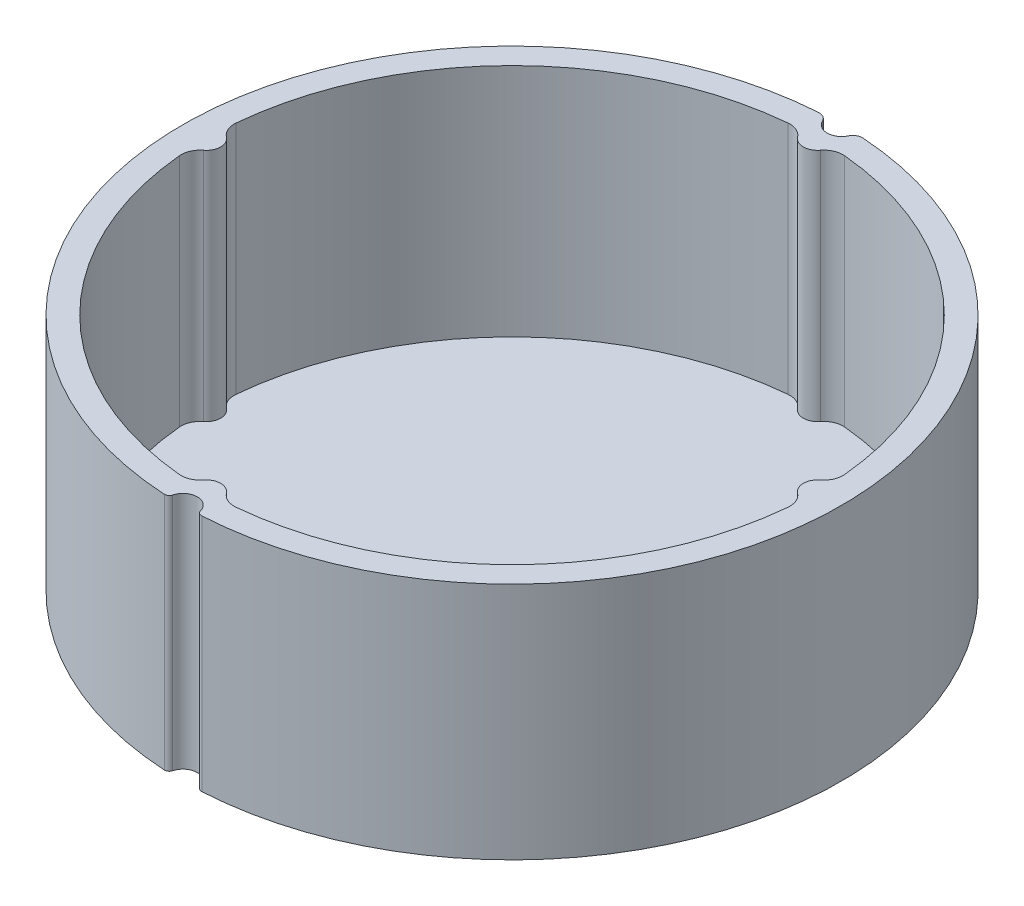
ISO-10303-21;
HEADER;
FILE_DESCRIPTION(('STEP AP214'),'2;1');
FILE_NAME('part.step','',(''),(''),'','','');
FILE_SCHEMA(('AUTOMOTIVE_DESIGN { 1 0 10303 214 1 1 1 1 }'));
ENDSEC;
DATA;
#1=APPLICATION_CONTEXT('core data for automotive mechanical design processes');
#2=APPLICATION_PROTOCOL_DEFINITION('international standard','automotive_design',2000,#1);
#3=PRODUCT_CONTEXT('',#1,'mechanical');
#4=PRODUCT('Part','Part','',(#3));
#5=PRODUCT_RELATED_PRODUCT_CATEGORY('part','',(#4));
#6=PRODUCT_DEFINITION_FORMATION('','',#4);
#7=PRODUCT_DEFINITION_CONTEXT('part definition',#1,'design');
#8=PRODUCT_DEFINITION('design','',#6,#7);
#9=PRODUCT_DEFINITION_SHAPE('','',#8);
#10=(LENGTH_UNIT() NAMED_UNIT(*) SI_UNIT(.MILLI.,.METRE.));
#11=(NAMED_UNIT(*) PLANE_ANGLE_UNIT() SI_UNIT($,.RADIAN.));
#12=(NAMED_UNIT(*) SI_UNIT($,.STERADIAN.) SOLID_ANGLE_UNIT());
#13=UNCERTAINTY_MEASURE_WITH_UNIT(LENGTH_MEASURE(1.E-05),#10,'distance_accuracy_value','');
#14=(GEOMETRIC_REPRESENTATION_CONTEXT(3) GLOBAL_UNCERTAINTY_ASSIGNED_CONTEXT((#13)) GLOBAL_UNIT_ASSIGNED_CONTEXT((#10,
#11,#12)) REPRESENTATION_CONTEXT('',''));
#15=CARTESIAN_POINT('',(0.,0.,0.));
#16=DIRECTION('',(0.,0.,1.));
#17=DIRECTION('',(1.,0.,0.));
#18=AXIS2_PLACEMENT_3D('',#15,#16,#17);
#19=CARTESIAN_POINT('',(0.,25.,0.));
#20=DIRECTION('',(0.,1.,0.));
#21=DIRECTION('',(0.,0.,1.));
#22=AXIS2_PLACEMENT_3D('',#19,#20,#21);
#23=PLANE('',#22);
#24=CARTESIAN_POINT('',(-1.93575856721061,25.,33.9428491683965));
#25=DIRECTION('',(0.,1.,0.));
#26=DIRECTION('',(0.,0.,1.));
#27=AXIS2_PLACEMENT_3D('',#24,#25,#26);
#28=CIRCLE('',#27,0.500000000000003);
#29=CARTESIAN_POINT('',(-1.45181892540796,25.,34.0685568574689));
#30=VERTEX_POINT('',#29);
#31=CARTESIAN_POINT('',(-1.96422560496371,25.,34.4420381383884));
#32=VERTEX_POINT('',#31);
#33=EDGE_CURVE('E338',#30,#32,#28,.F.);
#34=ORIENTED_EDGE('',*,*,#33,.F.);
#35=CARTESIAN_POINT('',(0.,25.,34.4456799246862));
#36=DIRECTION('',(0.,1.,0.));
#37=DIRECTION('',(0.,0.,1.));
#38=AXIS2_PLACEMENT_3D('',#35,#36,#37);
#39=CIRCLE('',#38,1.50000000000002);
#40=CARTESIAN_POINT('',(1.45181892540796,25.,34.0685568574689));
#41=VERTEX_POINT('',#40);
#42=EDGE_CURVE('E342',#41,#30,#39,.T.);
#43=ORIENTED_EDGE('',*,*,#42,.F.);
#44=CARTESIAN_POINT('',(1.93575856721061,25.,33.9428491683965));
#45=DIRECTION('',(0.,1.,0.));
#46=DIRECTION('',(0.,0.,1.));
#47=AXIS2_PLACEMENT_3D('',#44,#45,#46);
#48=CIRCLE('',#47,0.500000000000003);
#49=CARTESIAN_POINT('',(1.9642256049637,25.,34.4420381383884));
#50=VERTEX_POINT('',#49);
#51=EDGE_CURVE('E347',#41,#50,#48,.T.);
#52=ORIENTED_EDGE('',*,*,#51,.T.);
#53=CARTESIAN_POINT('',(0.,25.,-0.0020007910519898));
#54=DIRECTION('',(0.,1.,0.));
#55=DIRECTION('',(0.,0.,1.));
#56=AXIS2_PLACEMENT_3D('',#53,#54,#55);
#57=CIRCLE('',#56,34.5);
#58=CARTESIAN_POINT('',(2.32413582105506,25.,-34.4236276074198));
#59=VERTEX_POINT('',#58);
#60=EDGE_CURVE('E350',#50,#59,#57,.T.);
#61=ORIENTED_EDGE('',*,*,#60,.T.);
#62=CARTESIAN_POINT('',(2.2567695653723,25.,-33.4258992939019));
#63=DIRECTION('',(0.,1.,0.));
#64=DIRECTION('',(0.,0.,1.));
#65=AXIS2_PLACEMENT_3D('',#62,#63,#64);
#66=CIRCLE('',#65,1.);
#67=CARTESIAN_POINT('',(1.35406173922335,25.,-33.8561533823304));
#68=VERTEX_POINT('',#67);
#69=EDGE_CURVE('E353',#68,#59,#66,.F.);
#70=ORIENTED_EDGE('',*,*,#69,.F.);
#71=CARTESIAN_POINT('',(0.,25.,-34.5015345149731));
#72=DIRECTION('',(0.,1.,0.));
#73=DIRECTION('',(0.,0.,1.));
#74=AXIS2_PLACEMENT_3D('',#71,#72,#73);
#75=CIRCLE('',#74,1.49999999999991);
#76=CARTESIAN_POINT('',(-1.35406173922335,25.,-33.8561533823304));
#77=VERTEX_POINT('',#76);
#78=EDGE_CURVE('E357',#77,#68,#75,.T.);
#79=ORIENTED_EDGE('',*,*,#78,.F.);
#80=CARTESIAN_POINT('',(-2.2567695653723,25.,-33.4258992939019));
#81=DIRECTION('',(0.,1.,0.));
#82=DIRECTION('',(0.,0.,1.));
#83=AXIS2_PLACEMENT_3D('',#80,#81,#82);
#84=CIRCLE('',#83,1.);
#85=CARTESIAN_POINT('',(-2.32413582105505,25.,-34.4236276074198));
#86=VERTEX_POINT('',#85);
#87=EDGE_CURVE('E361',#77,#86,#84,.T.);
#88=ORIENTED_EDGE('',*,*,#87,.T.);
#89=CARTESIAN_POINT('',(0.,25.,-0.0020007910519898));
#90=DIRECTION('',(0.,1.,0.));
#91=DIRECTION('',(0.,0.,1.));
#92=AXIS2_PLACEMENT_3D('',#89,#90,#91);
#93=CIRCLE('',#92,34.5);
#94=EDGE_CURVE('E364',#86,#32,#93,.T.);
#95=ORIENTED_EDGE('',*,*,#94,.T.);
#96=EDGE_LOOP('',(#34,#43,#52,#61,#70,#79,#88,#95));
#97=FACE_BOUND('',#96,.T.);
#98=CARTESIAN_POINT('',(0.,25.,0.));
#99=DIRECTION('',(0.,1.,0.));
#100=DIRECTION('',(0.,0.,1.));
#101=AXIS2_PLACEMENT_3D('',#98,#99,#100);
#102=CIRCLE('',#101,32.);
#103=CARTESIAN_POINT('',(-31.8625,25.,2.9632910336314));
#104=VERTEX_POINT('',#103);
#105=CARTESIAN_POINT('',(-2.96329103363136,25.,31.8625));
#106=VERTEX_POINT('',#105);
#107=EDGE_CURVE('E233',#104,#106,#102,.T.);
#108=ORIENTED_EDGE('',*,*,#107,.F.);
#109=CARTESIAN_POINT('',(-29.87109375,25.,2.77808534402944));
#110=DIRECTION('',(0.,1.,0.));
#111=DIRECTION('',(0.,0.,1.));
#112=AXIS2_PLACEMENT_3D('',#109,#110,#111);
#113=CIRCLE('',#112,2.);
#114=CARTESIAN_POINT('',(-31.0876116071428,25.,1.19060800458406));
#115=VERTEX_POINT('',#114);
#116=EDGE_CURVE('E229',#115,#104,#113,.T.);
#117=ORIENTED_EDGE('',*,*,#116,.F.);
#118=CARTESIAN_POINT('',(-32.,25.,0.));
#119=DIRECTION('',(0.,-1.,0.));
#120=DIRECTION('',(0.,0.,1.));
#121=AXIS2_PLACEMENT_3D('',#118,#119,#120);
#122=CIRCLE('',#121,1.50000000000004);
#123=CARTESIAN_POINT('',(-31.0876116071428,25.,-1.19060800458406));
#124=VERTEX_POINT('',#123);
#125=EDGE_CURVE('E211',#124,#115,#122,.T.);
#126=ORIENTED_EDGE('',*,*,#125,.F.);
#127=CARTESIAN_POINT('',(-29.87109375,25.,-2.77808534402944));
#128=DIRECTION('',(0.,1.,0.));
#129=DIRECTION('',(0.,0.,-1.));
#130=AXIS2_PLACEMENT_3D('',#127,#128,#129);
#131=CIRCLE('',#130,2.);
#132=CARTESIAN_POINT('',(-31.8625,25.,-2.9632910336314));
#133=VERTEX_POINT('',#132);
#134=EDGE_CURVE('E277',#133,#124,#131,.T.);
#135=ORIENTED_EDGE('',*,*,#134,.F.);
#136=CARTESIAN_POINT('',(0.,25.,0.));
#137=DIRECTION('',(0.,1.,0.));
#138=DIRECTION('',(0.,0.,1.));
#139=AXIS2_PLACEMENT_3D('',#136,#137,#138);
#140=CIRCLE('',#139,32.);
#141=CARTESIAN_POINT('',(-2.96329103363135,25.,-31.8625));
#142=VERTEX_POINT('',#141);
#143=EDGE_CURVE('E274',#142,#133,#140,.T.);
#144=ORIENTED_EDGE('',*,*,#143,.F.);
#145=CARTESIAN_POINT('',(-2.7780853440294,25.,-29.87109375));
#146=DIRECTION('',(0.,1.,0.));
#147=DIRECTION('',(0.,0.,1.));
#148=AXIS2_PLACEMENT_3D('',#145,#146,#147);
#149=CIRCLE('',#148,2.);
#150=CARTESIAN_POINT('',(-1.19060800458403,25.,-31.0876116071429));
#151=VERTEX_POINT('',#150);
#152=EDGE_CURVE('E271',#151,#142,#149,.T.);
#153=ORIENTED_EDGE('',*,*,#152,.F.);
#154=CARTESIAN_POINT('',(0.,25.,-32.));
#155=DIRECTION('',(0.,-1.,0.));
#156=DIRECTION('',(0.,0.,1.));
#157=AXIS2_PLACEMENT_3D('',#154,#155,#156);
#158=CIRCLE('',#157,1.5);
#159=CARTESIAN_POINT('',(1.19060800458403,25.,-31.0876116071429));
#160=VERTEX_POINT('',#159);
#161=EDGE_CURVE('E268',#160,#151,#158,.T.);
#162=ORIENTED_EDGE('',*,*,#161,.F.);
#163=CARTESIAN_POINT('',(2.7780853440294,25.,-29.87109375));
#164=DIRECTION('',(0.,1.,0.));
#165=DIRECTION('',(0.,0.,-1.));
#166=AXIS2_PLACEMENT_3D('',#163,#164,#165);
#167=CIRCLE('',#166,2.);
#168=CARTESIAN_POINT('',(2.96329103363136,25.,-31.8625));
#169=VERTEX_POINT('',#168);
#170=EDGE_CURVE('E265',#169,#160,#167,.T.);
#171=ORIENTED_EDGE('',*,*,#170,.F.);
#172=CARTESIAN_POINT('',(0.,25.,0.));
#173=DIRECTION('',(0.,1.,0.));
#174=DIRECTION('',(0.,0.,1.));
#175=AXIS2_PLACEMENT_3D('',#172,#173,#174);
#176=CIRCLE('',#175,32.);
#177=CARTESIAN_POINT('',(31.8625,25.,-2.96329103363136));
#178=VERTEX_POINT('',#177);
#179=EDGE_CURVE('E262',#178,#169,#176,.T.);
#180=ORIENTED_EDGE('',*,*,#179,.F.);
#181=CARTESIAN_POINT('',(29.87109375,25.,-2.7780853440294));
#182=DIRECTION('',(0.,1.,0.));
#183=DIRECTION('',(0.,0.,1.));
#184=AXIS2_PLACEMENT_3D('',#181,#182,#183);
#185=CIRCLE('',#184,2.);
#186=CARTESIAN_POINT('',(31.0876116071429,25.,-1.19060800458403));
#187=VERTEX_POINT('',#186);
#188=EDGE_CURVE('E259',#187,#178,#185,.T.);
#189=ORIENTED_EDGE('',*,*,#188,.F.);
#190=CARTESIAN_POINT('',(32.,25.,0.));
#191=DIRECTION('',(0.,-1.,0.));
#192=DIRECTION('',(0.,0.,1.));
#193=AXIS2_PLACEMENT_3D('',#190,#191,#192);
#194=CIRCLE('',#193,1.5);
#195=CARTESIAN_POINT('',(31.0876116071429,25.,1.19060800458403));
#196=VERTEX_POINT('',#195);
#197=EDGE_CURVE('E256',#196,#187,#194,.T.);
#198=ORIENTED_EDGE('',*,*,#197,.F.);
#199=CARTESIAN_POINT('',(29.87109375,25.,2.7780853440294));
#200=DIRECTION('',(0.,1.,0.));
#201=DIRECTION('',(0.,0.,-1.));
#202=AXIS2_PLACEMENT_3D('',#199,#200,#201);
#203=CIRCLE('',#202,2.);
#204=CARTESIAN_POINT('',(31.8625,25.,2.96329103363136));
#205=VERTEX_POINT('',#204);
#206=EDGE_CURVE('E253',#205,#196,#203,.T.);
#207=ORIENTED_EDGE('',*,*,#206,.F.);
#208=CARTESIAN_POINT('',(0.,25.,0.));
#209=DIRECTION('',(0.,1.,0.));
#210=DIRECTION('',(0.,0.,1.));
#211=AXIS2_PLACEMENT_3D('',#208,#209,#210);
#212=CIRCLE('',#211,32.);
#213=CARTESIAN_POINT('',(2.96329103363136,25.,31.8625));
#214=VERTEX_POINT('',#213);
#215=EDGE_CURVE('E250',#214,#205,#212,.T.);
#216=ORIENTED_EDGE('',*,*,#215,.F.);
#217=CARTESIAN_POINT('',(2.7780853440294,25.,29.87109375));
#218=DIRECTION('',(0.,1.,0.));
#219=DIRECTION('',(0.,0.,1.));
#220=AXIS2_PLACEMENT_3D('',#217,#218,#219);
#221=CIRCLE('',#220,2.);
#222=CARTESIAN_POINT('',(1.19060800458403,25.,31.0876116071429));
#223=VERTEX_POINT('',#222);
#224=EDGE_CURVE('E247',#223,#214,#221,.T.);
#225=ORIENTED_EDGE('',*,*,#224,.F.);
#226=CARTESIAN_POINT('',(0.,25.,32.));
#227=DIRECTION('',(0.,-1.,0.));
#228=DIRECTION('',(0.,0.,1.));
#229=AXIS2_PLACEMENT_3D('',#226,#227,#228);
#230=CIRCLE('',#229,1.5);
#231=CARTESIAN_POINT('',(-1.19060800458403,25.,31.0876116071429));
#232=VERTEX_POINT('',#231);
#233=EDGE_CURVE('E244',#232,#223,#230,.T.);
#234=ORIENTED_EDGE('',*,*,#233,.F.);
#235=CARTESIAN_POINT('',(-2.7780853440294,25.,29.87109375));
#236=DIRECTION('',(0.,1.,0.));
#237=DIRECTION('',(0.,0.,-1.));
#238=AXIS2_PLACEMENT_3D('',#235,#236,#237);
#239=CIRCLE('',#238,2.);
#240=EDGE_CURVE('E241',#106,#232,#239,.T.);
#241=ORIENTED_EDGE('',*,*,#240,.F.);
#242=EDGE_LOOP('',(#108,#117,#126,#135,#144,#153,#162,#171,#180,#189,#198,#207,#216,#225,#234,#241));
#243=FACE_BOUND('',#242,.T.);
#244=ADVANCED_FACE('F41',(#97,#243),#23,.T.);
#245=CARTESIAN_POINT('',(0.,0.,0.));
#246=DIRECTION('',(0.,1.,0.));
#247=DIRECTION('',(0.,0.,1.));
#248=AXIS2_PLACEMENT_3D('',#245,#246,#247);
#249=PLANE('',#248);
#250=CARTESIAN_POINT('',(-1.93575856721061,0.,33.9428491683965));
#251=DIRECTION('',(0.,1.,0.));
#252=DIRECTION('',(0.,0.,1.));
#253=AXIS2_PLACEMENT_3D('',#250,#251,#252);
#254=CIRCLE('',#253,0.500000000000003);
#255=CARTESIAN_POINT('',(-1.45181892540796,0.,34.0685568574689));
#256=VERTEX_POINT('',#255);
#257=CARTESIAN_POINT('',(-1.96422560496371,0.,34.4420381383884));
#258=VERTEX_POINT('',#257);
#259=EDGE_CURVE('E337',#256,#258,#254,.F.);
#260=ORIENTED_EDGE('',*,*,#259,.T.);
#261=CARTESIAN_POINT('',(0.,0.,-0.0020007910519898));
#262=DIRECTION('',(0.,1.,0.));
#263=DIRECTION('',(0.,0.,1.));
#264=AXIS2_PLACEMENT_3D('',#261,#262,#263);
#265=CIRCLE('',#264,34.5);
#266=CARTESIAN_POINT('',(-2.32413582105505,0.,-34.4236276074198));
#267=VERTEX_POINT('',#266);
#268=EDGE_CURVE('E343',#267,#258,#265,.T.);
#269=ORIENTED_EDGE('',*,*,#268,.F.);
#270=CARTESIAN_POINT('',(-2.2567695653723,0.,-33.4258992939019));
#271=DIRECTION('',(0.,1.,0.));
#272=DIRECTION('',(0.,0.,1.));
#273=AXIS2_PLACEMENT_3D('',#270,#271,#272);
#274=CIRCLE('',#273,1.);
#275=CARTESIAN_POINT('',(-1.35406173922335,0.,-33.8561533823304));
#276=VERTEX_POINT('',#275);
#277=EDGE_CURVE('E390',#276,#267,#274,.T.);
#278=ORIENTED_EDGE('',*,*,#277,.F.);
#279=CARTESIAN_POINT('',(0.,0.,-34.5015345149731));
#280=DIRECTION('',(0.,1.,0.));
#281=DIRECTION('',(0.,0.,1.));
#282=AXIS2_PLACEMENT_3D('',#279,#280,#281);
#283=CIRCLE('',#282,1.49999999999991);
#284=CARTESIAN_POINT('',(1.35406173922335,0.,-33.8561533823304));
#285=VERTEX_POINT('',#284);
#286=EDGE_CURVE('E386',#276,#285,#283,.T.);
#287=ORIENTED_EDGE('',*,*,#286,.T.);
#288=CARTESIAN_POINT('',(2.2567695653723,0.,-33.4258992939019));
#289=DIRECTION('',(0.,1.,0.));
#290=DIRECTION('',(0.,0.,1.));
#291=AXIS2_PLACEMENT_3D('',#288,#289,#290);
#292=CIRCLE('',#291,1.);
#293=CARTESIAN_POINT('',(2.32413582105506,0.,-34.4236276074198));
#294=VERTEX_POINT('',#293);
#295=EDGE_CURVE('E382',#285,#294,#292,.F.);
#296=ORIENTED_EDGE('',*,*,#295,.T.);
#297=CARTESIAN_POINT('',(0.,0.,-0.0020007910519898));
#298=DIRECTION('',(0.,1.,0.));
#299=DIRECTION('',(0.,0.,1.));
#300=AXIS2_PLACEMENT_3D('',#297,#298,#299);
#301=CIRCLE('',#300,34.5);
#302=CARTESIAN_POINT('',(1.9642256049637,0.,34.4420381383884));
#303=VERTEX_POINT('',#302);
#304=EDGE_CURVE('E378',#303,#294,#301,.T.);
#305=ORIENTED_EDGE('',*,*,#304,.F.);
#306=CARTESIAN_POINT('',(1.93575856721061,0.,33.9428491683965));
#307=DIRECTION('',(0.,1.,0.));
#308=DIRECTION('',(0.,0.,1.));
#309=AXIS2_PLACEMENT_3D('',#306,#307,#308);
#310=CIRCLE('',#309,0.500000000000003);
#311=CARTESIAN_POINT('',(1.45181892540796,0.,34.0685568574689));
#312=VERTEX_POINT('',#311);
#313=EDGE_CURVE('E375',#312,#303,#310,.T.);
#314=ORIENTED_EDGE('',*,*,#313,.F.);
#315=CARTESIAN_POINT('',(0.,0.,34.4456799246862));
#316=DIRECTION('',(0.,1.,0.));
#317=DIRECTION('',(0.,0.,1.));
#318=AXIS2_PLACEMENT_3D('',#315,#316,#317);
#319=CIRCLE('',#318,1.50000000000002);
#320=EDGE_CURVE('E371',#312,#256,#319,.T.);
#321=ORIENTED_EDGE('',*,*,#320,.T.);
#322=EDGE_LOOP('',(#260,#269,#278,#287,#296,#305,#314,#321));
#323=FACE_BOUND('',#322,.T.);
#324=ADVANCED_FACE('F425',(#323),#249,.F.);
#325=CARTESIAN_POINT('',(-1.93575856721061,25.,33.9428491683965));
#326=DIRECTION('',(0.,-1.,0.));
#327=DIRECTION('',(0.,0.,-1.));
#328=AXIS2_PLACEMENT_3D('',#325,#326,#327);
#329=CYLINDRICAL_SURFACE('',#328,0.500000000000003);
#330=ORIENTED_EDGE('',*,*,#259,.F.);
#331=DIRECTION('',(0.,-1.,0.));
#332=VECTOR('',#331,1.);
#333=CARTESIAN_POINT('',(-1.45181892540796,25.,34.0685568574689));
#334=LINE('',#333,#332);
#335=EDGE_CURVE('E11',#30,#256,#334,.T.);
#336=ORIENTED_EDGE('',*,*,#335,.F.);
#337=ORIENTED_EDGE('',*,*,#33,.T.);
#338=DIRECTION('',(0.,-1.,0.));
#339=VECTOR('',#338,1.);
#340=CARTESIAN_POINT('',(-1.96422560496371,25.,34.4420381383884));
#341=LINE('',#340,#339);
#342=EDGE_CURVE('E367',#32,#258,#341,.T.);
#343=ORIENTED_EDGE('',*,*,#342,.T.);
#344=EDGE_LOOP('',(#330,#336,#337,#343));
#345=FACE_BOUND('',#344,.T.);
#346=ADVANCED_FACE('F43',(#345),#329,.T.);
#347=CARTESIAN_POINT('',(0.,25.,34.4456799246862));
#348=DIRECTION('',(0.,-1.,0.));
#349=DIRECTION('',(0.,0.,-1.));
#350=AXIS2_PLACEMENT_3D('',#347,#348,#349);
#351=CYLINDRICAL_SURFACE('',#350,1.50000000000002);
#352=ORIENTED_EDGE('',*,*,#320,.F.);
#353=DIRECTION('',(0.,-1.,0.));
#354=VECTOR('',#353,1.);
#355=CARTESIAN_POINT('',(1.45181892540796,25.,34.0685568574689));
#356=LINE('',#355,#354);
#357=EDGE_CURVE('E50',#41,#312,#356,.T.);
#358=ORIENTED_EDGE('',*,*,#357,.F.);
#359=ORIENTED_EDGE('',*,*,#42,.T.);
#360=ORIENTED_EDGE('',*,*,#335,.T.);
#361=EDGE_LOOP('',(#352,#358,#359,#360));
#362=FACE_BOUND('',#361,.T.);
#363=ADVANCED_FACE('F426',(#362),#351,.F.);
#364=CARTESIAN_POINT('',(1.93575856721061,25.,33.9428491683965));
#365=DIRECTION('',(0.,-1.,0.));
#366=DIRECTION('',(0.,0.,-1.));
#367=AXIS2_PLACEMENT_3D('',#364,#365,#366);
#368=CYLINDRICAL_SURFACE('',#367,0.500000000000003);
#369=ORIENTED_EDGE('',*,*,#313,.T.);
#370=DIRECTION('',(0.,-1.,0.));
#371=VECTOR('',#370,1.);
#372=CARTESIAN_POINT('',(1.9642256049637,25.,34.4420381383884));
#373=LINE('',#372,#371);
#374=EDGE_CURVE('E411',#50,#303,#373,.T.);
#375=ORIENTED_EDGE('',*,*,#374,.F.);
#376=ORIENTED_EDGE('',*,*,#51,.F.);
#377=ORIENTED_EDGE('',*,*,#357,.T.);
#378=EDGE_LOOP('',(#369,#375,#376,#377));
#379=FACE_BOUND('',#378,.T.);
#380=ADVANCED_FACE('F418',(#379),#368,.T.);
#381=CARTESIAN_POINT('',(0.,25.,-0.0020007910519898));
#382=DIRECTION('',(0.,-1.,0.));
#383=DIRECTION('',(0.,0.,-1.));
#384=AXIS2_PLACEMENT_3D('',#381,#382,#383);
#385=CYLINDRICAL_SURFACE('',#384,34.5);
#386=ORIENTED_EDGE('',*,*,#304,.T.);
#387=DIRECTION('',(0.,-1.,0.));
#388=VECTOR('',#387,1.);
#389=CARTESIAN_POINT('',(2.32413582105506,25.,-34.4236276074198));
#390=LINE('',#389,#388);
#391=EDGE_CURVE('E408',#59,#294,#390,.T.);
#392=ORIENTED_EDGE('',*,*,#391,.F.);
#393=ORIENTED_EDGE('',*,*,#60,.F.);
#394=ORIENTED_EDGE('',*,*,#374,.T.);
#395=EDGE_LOOP('',(#386,#392,#393,#394));
#396=FACE_BOUND('',#395,.T.);
#397=ADVANCED_FACE('F451',(#396),#385,.T.);
#398=CARTESIAN_POINT('',(2.2567695653723,25.,-33.4258992939019));
#399=DIRECTION('',(0.,-1.,0.));
#400=DIRECTION('',(0.,0.,-1.));
#401=AXIS2_PLACEMENT_3D('',#398,#399,#400);
#402=CYLINDRICAL_SURFACE('',#401,1.);
#403=ORIENTED_EDGE('',*,*,#295,.F.);
#404=DIRECTION('',(0.,-1.,0.));
#405=VECTOR('',#404,1.);
#406=CARTESIAN_POINT('',(1.35406173922335,25.,-33.8561533823304));
#407=LINE('',#406,#405);
#408=EDGE_CURVE('E405',#68,#285,#407,.T.);
#409=ORIENTED_EDGE('',*,*,#408,.F.);
#410=ORIENTED_EDGE('',*,*,#69,.T.);
#411=ORIENTED_EDGE('',*,*,#391,.T.);
#412=EDGE_LOOP('',(#403,#409,#410,#411));
#413=FACE_BOUND('',#412,.T.);
#414=ADVANCED_FACE('F446',(#413),#402,.T.);
#415=CARTESIAN_POINT('',(0.,25.,-34.5015345149731));
#416=DIRECTION('',(0.,-1.,0.));
#417=DIRECTION('',(0.,0.,-1.));
#418=AXIS2_PLACEMENT_3D('',#415,#416,#417);
#419=CYLINDRICAL_SURFACE('',#418,1.49999999999991);
#420=ORIENTED_EDGE('',*,*,#286,.F.);
#421=DIRECTION('',(0.,-1.,0.));
#422=VECTOR('',#421,1.);
#423=CARTESIAN_POINT('',(-1.35406173922335,25.,-33.8561533823304));
#424=LINE('',#423,#422);
#425=EDGE_CURVE('E402',#77,#276,#424,.T.);
#426=ORIENTED_EDGE('',*,*,#425,.F.);
#427=ORIENTED_EDGE('',*,*,#78,.T.);
#428=ORIENTED_EDGE('',*,*,#408,.T.);
#429=EDGE_LOOP('',(#420,#426,#427,#428));
#430=FACE_BOUND('',#429,.T.);
#431=ADVANCED_FACE('F443',(#430),#419,.F.);
#432=CARTESIAN_POINT('',(-2.2567695653723,25.,-33.4258992939019));
#433=DIRECTION('',(0.,-1.,0.));
#434=DIRECTION('',(0.,0.,-1.));
#435=AXIS2_PLACEMENT_3D('',#432,#433,#434);
#436=CYLINDRICAL_SURFACE('',#435,1.);
#437=ORIENTED_EDGE('',*,*,#277,.T.);
#438=DIRECTION('',(0.,-1.,0.));
#439=VECTOR('',#438,1.);
#440=CARTESIAN_POINT('',(-2.32413582105505,25.,-34.4236276074198));
#441=LINE('',#440,#439);
#442=EDGE_CURVE('E398',#86,#267,#441,.T.);
#443=ORIENTED_EDGE('',*,*,#442,.F.);
#444=ORIENTED_EDGE('',*,*,#87,.F.);
#445=ORIENTED_EDGE('',*,*,#425,.T.);
#446=EDGE_LOOP('',(#437,#443,#444,#445));
#447=FACE_BOUND('',#446,.T.);
#448=ADVANCED_FACE('F440',(#447),#436,.T.);
#449=CARTESIAN_POINT('',(0.,25.,-0.0020007910519898));
#450=DIRECTION('',(0.,-1.,0.));
#451=DIRECTION('',(0.,0.,-1.));
#452=AXIS2_PLACEMENT_3D('',#449,#450,#451);
#453=CYLINDRICAL_SURFACE('',#452,34.5);
#454=ORIENTED_EDGE('',*,*,#268,.T.);
#455=ORIENTED_EDGE('',*,*,#342,.F.);
#456=ORIENTED_EDGE('',*,*,#94,.F.);
#457=ORIENTED_EDGE('',*,*,#442,.T.);
#458=EDGE_LOOP('',(#454,#455,#456,#457));
#459=FACE_BOUND('',#458,.T.);
#460=ADVANCED_FACE('F435',(#459),#453,.T.);
#461=CARTESIAN_POINT('',(-29.87109375,25.,2.77808534402944));
#462=DIRECTION('',(0.,-1.,0.));
#463=DIRECTION('',(0.,0.,-1.));
#464=AXIS2_PLACEMENT_3D('',#461,#462,#463);
#465=CYLINDRICAL_SURFACE('',#464,2.);
#466=CARTESIAN_POINT('',(-29.87109375,0.4,2.77808534402944));
#467=DIRECTION('',(0.,1.,0.));
#468=DIRECTION('',(0.,0.,1.));
#469=AXIS2_PLACEMENT_3D('',#466,#467,#468);
#470=CIRCLE('',#469,2.);
#471=CARTESIAN_POINT('',(-31.0876116071428,0.4,1.19060800458406));
#472=VERTEX_POINT('',#471);
#473=CARTESIAN_POINT('',(-31.8625,0.400000000000001,2.9632910336314));
#474=VERTEX_POINT('',#473);
#475=EDGE_CURVE('E218',#472,#474,#470,.T.);
#476=ORIENTED_EDGE('',*,*,#475,.F.);
#477=DIRECTION('',(0.,-1.,0.));
#478=VECTOR('',#477,1.);
#479=CARTESIAN_POINT('',(-31.0876116071428,25.,1.19060800458406));
#480=LINE('',#479,#478);
#481=EDGE_CURVE('E204',#115,#472,#480,.T.);
#482=ORIENTED_EDGE('',*,*,#481,.F.);
#483=ORIENTED_EDGE('',*,*,#116,.T.);
#484=DIRECTION('',(0.,-1.,0.));
#485=VECTOR('',#484,1.);
#486=CARTESIAN_POINT('',(-31.8625,25.,2.9632910336314));
#487=LINE('',#486,#485);
#488=EDGE_CURVE('E220',#104,#474,#487,.T.);
#489=ORIENTED_EDGE('',*,*,#488,.T.);
#490=EDGE_LOOP('',(#476,#482,#483,#489));
#491=FACE_BOUND('',#490,.T.);
#492=ADVANCED_FACE('F219',(#491),#465,.F.);
#493=CARTESIAN_POINT('',(0.,25.,0.));
#494=DIRECTION('',(0.,-1.,0.));
#495=DIRECTION('',(0.,0.,-1.));
#496=AXIS2_PLACEMENT_3D('',#493,#494,#495);
#497=CYLINDRICAL_SURFACE('',#496,32.);
#498=CARTESIAN_POINT('',(0.,0.4,0.));
#499=DIRECTION('',(0.,1.,0.));
#500=DIRECTION('',(0.,0.,1.));
#501=AXIS2_PLACEMENT_3D('',#498,#499,#500);
#502=CIRCLE('',#501,32.);
#503=CARTESIAN_POINT('',(-2.96329103363136,0.400000000000001,31.8625));
#504=VERTEX_POINT('',#503);
#505=EDGE_CURVE('E57',#474,#504,#502,.T.);
#506=ORIENTED_EDGE('',*,*,#505,.F.);
#507=ORIENTED_EDGE('',*,*,#488,.F.);
#508=ORIENTED_EDGE('',*,*,#107,.T.);
#509=DIRECTION('',(0.,-1.,0.));
#510=VECTOR('',#509,1.);
#511=CARTESIAN_POINT('',(-2.96329103363136,25.,31.8625));
#512=LINE('',#511,#510);
#513=EDGE_CURVE('E332',#106,#504,#512,.T.);
#514=ORIENTED_EDGE('',*,*,#513,.T.);
#515=EDGE_LOOP('',(#506,#507,#508,#514));
#516=FACE_BOUND('',#515,.T.);
#517=ADVANCED_FACE('F459',(#516),#497,.F.);
#518=CARTESIAN_POINT('',(-2.7780853440294,25.,29.87109375));
#519=DIRECTION('',(0.,-1.,0.));
#520=DIRECTION('',(0.,0.,-1.));
#521=AXIS2_PLACEMENT_3D('',#518,#519,#520);
#522=CYLINDRICAL_SURFACE('',#521,2.);
#523=CARTESIAN_POINT('',(-2.7780853440294,0.4,29.87109375));
#524=DIRECTION('',(0.,1.,0.));
#525=DIRECTION('',(0.,0.,-1.));
#526=AXIS2_PLACEMENT_3D('',#523,#524,#525);
#527=CIRCLE('',#526,2.);
#528=CARTESIAN_POINT('',(-1.19060800458403,0.400000000000001,31.0876116071429));
#529=VERTEX_POINT('',#528);
#530=EDGE_CURVE('E65',#504,#529,#527,.T.);
#531=ORIENTED_EDGE('',*,*,#530,.F.);
#532=ORIENTED_EDGE('',*,*,#513,.F.);
#533=ORIENTED_EDGE('',*,*,#240,.T.);
#534=DIRECTION('',(0.,-1.,0.));
#535=VECTOR('',#534,1.);
#536=CARTESIAN_POINT('',(-1.19060800458403,25.,31.0876116071429));
#537=LINE('',#536,#535);
#538=EDGE_CURVE('E329',#232,#529,#537,.T.);
#539=ORIENTED_EDGE('',*,*,#538,.T.);
#540=EDGE_LOOP('',(#531,#532,#533,#539));
#541=FACE_BOUND('',#540,.T.);
#542=ADVANCED_FACE('F460',(#541),#522,.F.);
#543=CARTESIAN_POINT('',(0.,25.,32.));
#544=DIRECTION('',(0.,-1.,0.));
#545=DIRECTION('',(0.,0.,-1.));
#546=AXIS2_PLACEMENT_3D('',#543,#544,#545);
#547=CYLINDRICAL_SURFACE('',#546,1.5);
#548=CARTESIAN_POINT('',(0.,0.4,32.));
#549=DIRECTION('',(0.,-1.,0.));
#550=DIRECTION('',(0.,0.,1.));
#551=AXIS2_PLACEMENT_3D('',#548,#549,#550);
#552=CIRCLE('',#551,1.5);
#553=CARTESIAN_POINT('',(1.19060800458403,0.400000000000001,31.0876116071429));
#554=VERTEX_POINT('',#553);
#555=EDGE_CURVE('E466',#529,#554,#552,.T.);
#556=ORIENTED_EDGE('',*,*,#555,.F.);
#557=ORIENTED_EDGE('',*,*,#538,.F.);
#558=ORIENTED_EDGE('',*,*,#233,.T.);
#559=DIRECTION('',(0.,-1.,0.));
#560=VECTOR('',#559,1.);
#561=CARTESIAN_POINT('',(1.19060800458403,25.,31.0876116071429));
#562=LINE('',#561,#560);
#563=EDGE_CURVE('E325',#223,#554,#562,.T.);
#564=ORIENTED_EDGE('',*,*,#563,.T.);
#565=EDGE_LOOP('',(#556,#557,#558,#564));
#566=FACE_BOUND('',#565,.T.);
#567=ADVANCED_FACE('F463',(#566),#547,.T.);
#568=CARTESIAN_POINT('',(2.7780853440294,25.,29.87109375));
#569=DIRECTION('',(0.,-1.,0.));
#570=DIRECTION('',(0.,0.,-1.));
#571=AXIS2_PLACEMENT_3D('',#568,#569,#570);
#572=CYLINDRICAL_SURFACE('',#571,2.);
#573=CARTESIAN_POINT('',(2.7780853440294,0.4,29.87109375));
#574=DIRECTION('',(0.,1.,0.));
#575=DIRECTION('',(0.,0.,1.));
#576=AXIS2_PLACEMENT_3D('',#573,#574,#575);
#577=CIRCLE('',#576,2.);
#578=CARTESIAN_POINT('',(2.96329103363136,0.400000000000001,31.8625));
#579=VERTEX_POINT('',#578);
#580=EDGE_CURVE('E482',#554,#579,#577,.T.);
#581=ORIENTED_EDGE('',*,*,#580,.F.);
#582=ORIENTED_EDGE('',*,*,#563,.F.);
#583=ORIENTED_EDGE('',*,*,#224,.T.);
#584=DIRECTION('',(0.,-1.,0.));
#585=VECTOR('',#584,1.);
#586=CARTESIAN_POINT('',(2.96329103363136,25.,31.8625));
#587=LINE('',#586,#585);
#588=EDGE_CURVE('E321',#214,#579,#587,.T.);
#589=ORIENTED_EDGE('',*,*,#588,.T.);
#590=EDGE_LOOP('',(#581,#582,#583,#589));
#591=FACE_BOUND('',#590,.T.);
#592=ADVANCED_FACE('F472',(#591),#572,.F.);
#593=CARTESIAN_POINT('',(0.,25.,0.));
#594=DIRECTION('',(0.,-1.,0.));
#595=DIRECTION('',(0.,0.,-1.));
#596=AXIS2_PLACEMENT_3D('',#593,#594,#595);
#597=CYLINDRICAL_SURFACE('',#596,32.);
#598=CARTESIAN_POINT('',(0.,0.4,0.));
#599=DIRECTION('',(0.,1.,0.));
#600=DIRECTION('',(0.,0.,1.));
#601=AXIS2_PLACEMENT_3D('',#598,#599,#600);
#602=CIRCLE('',#601,32.);
#603=CARTESIAN_POINT('',(31.8625,0.400000000000001,2.96329103363136));
#604=VERTEX_POINT('',#603);
#605=EDGE_CURVE('E478',#579,#604,#602,.T.);
#606=ORIENTED_EDGE('',*,*,#605,.F.);
#607=ORIENTED_EDGE('',*,*,#588,.F.);
#608=ORIENTED_EDGE('',*,*,#215,.T.);
#609=DIRECTION('',(0.,-1.,0.));
#610=VECTOR('',#609,1.);
#611=CARTESIAN_POINT('',(31.8625,25.,2.96329103363136));
#612=LINE('',#611,#610);
#613=EDGE_CURVE('E317',#205,#604,#612,.T.);
#614=ORIENTED_EDGE('',*,*,#613,.T.);
#615=EDGE_LOOP('',(#606,#607,#608,#614));
#616=FACE_BOUND('',#615,.T.);
#617=ADVANCED_FACE('F475',(#616),#597,.F.);
#618=CARTESIAN_POINT('',(29.87109375,25.,2.7780853440294));
#619=DIRECTION('',(0.,-1.,0.));
#620=DIRECTION('',(0.,0.,-1.));
#621=AXIS2_PLACEMENT_3D('',#618,#619,#620);
#622=CYLINDRICAL_SURFACE('',#621,2.);
#623=CARTESIAN_POINT('',(29.87109375,0.4,2.7780853440294));
#624=DIRECTION('',(0.,1.,0.));
#625=DIRECTION('',(0.,0.,-1.));
#626=AXIS2_PLACEMENT_3D('',#623,#624,#625);
#627=CIRCLE('',#626,2.);
#628=CARTESIAN_POINT('',(31.0876116071429,0.400000000000001,1.19060800458403));
#629=VERTEX_POINT('',#628);
#630=EDGE_CURVE('E481',#604,#629,#627,.T.);
#631=ORIENTED_EDGE('',*,*,#630,.F.);
#632=ORIENTED_EDGE('',*,*,#613,.F.);
#633=ORIENTED_EDGE('',*,*,#206,.T.);
#634=DIRECTION('',(0.,-1.,0.));
#635=VECTOR('',#634,1.);
#636=CARTESIAN_POINT('',(31.0876116071429,25.,1.19060800458403));
#637=LINE('',#636,#635);
#638=EDGE_CURVE('E313',#196,#629,#637,.T.);
#639=ORIENTED_EDGE('',*,*,#638,.T.);
#640=EDGE_LOOP('',(#631,#632,#633,#639));
#641=FACE_BOUND('',#640,.T.);
#642=ADVANCED_FACE('F559',(#641),#622,.F.);
#643=CARTESIAN_POINT('',(32.,25.,0.));
#644=DIRECTION('',(0.,-1.,0.));
#645=DIRECTION('',(0.,0.,-1.));
#646=AXIS2_PLACEMENT_3D('',#643,#644,#645);
#647=CYLINDRICAL_SURFACE('',#646,1.5);
#648=CARTESIAN_POINT('',(32.,0.4,0.));
#649=DIRECTION('',(0.,-1.,0.));
#650=DIRECTION('',(0.,0.,1.));
#651=AXIS2_PLACEMENT_3D('',#648,#649,#650);
#652=CIRCLE('',#651,1.5);
#653=CARTESIAN_POINT('',(31.0876116071429,0.400000000000001,-1.19060800458403));
#654=VERTEX_POINT('',#653);
#655=EDGE_CURVE('E486',#629,#654,#652,.T.);
#656=ORIENTED_EDGE('',*,*,#655,.F.);
#657=ORIENTED_EDGE('',*,*,#638,.F.);
#658=ORIENTED_EDGE('',*,*,#197,.T.);
#659=DIRECTION('',(0.,-1.,0.));
#660=VECTOR('',#659,1.);
#661=CARTESIAN_POINT('',(31.0876116071429,25.,-1.19060800458403));
#662=LINE('',#661,#660);
#663=EDGE_CURVE('E309',#187,#654,#662,.T.);
#664=ORIENTED_EDGE('',*,*,#663,.T.);
#665=EDGE_LOOP('',(#656,#657,#658,#664));
#666=FACE_BOUND('',#665,.T.);
#667=ADVANCED_FACE('F555',(#666),#647,.T.);
#668=CARTESIAN_POINT('',(29.87109375,25.,-2.7780853440294));
#669=DIRECTION('',(0.,-1.,0.));
#670=DIRECTION('',(0.,0.,-1.));
#671=AXIS2_PLACEMENT_3D('',#668,#669,#670);
#672=CYLINDRICAL_SURFACE('',#671,2.);
#673=CARTESIAN_POINT('',(29.87109375,0.4,-2.7780853440294));
#674=DIRECTION('',(0.,1.,0.));
#675=DIRECTION('',(0.,0.,1.));
#676=AXIS2_PLACEMENT_3D('',#673,#674,#675);
#677=CIRCLE('',#676,2.);
#678=CARTESIAN_POINT('',(31.8625,0.400000000000001,-2.96329103363136));
#679=VERTEX_POINT('',#678);
#680=EDGE_CURVE('E494',#654,#679,#677,.T.);
#681=ORIENTED_EDGE('',*,*,#680,.F.);
#682=ORIENTED_EDGE('',*,*,#663,.F.);
#683=ORIENTED_EDGE('',*,*,#188,.T.);
#684=DIRECTION('',(0.,-1.,0.));
#685=VECTOR('',#684,1.);
#686=CARTESIAN_POINT('',(31.8625,25.,-2.96329103363136));
#687=LINE('',#686,#685);
#688=EDGE_CURVE('E305',#178,#679,#687,.T.);
#689=ORIENTED_EDGE('',*,*,#688,.T.);
#690=EDGE_LOOP('',(#681,#682,#683,#689));
#691=FACE_BOUND('',#690,.T.);
#692=ADVANCED_FACE('F551',(#691),#672,.F.);
#693=CARTESIAN_POINT('',(0.,25.,0.));
#694=DIRECTION('',(0.,-1.,0.));
#695=DIRECTION('',(0.,0.,-1.));
#696=AXIS2_PLACEMENT_3D('',#693,#694,#695);
#697=CYLINDRICAL_SURFACE('',#696,32.);
#698=CARTESIAN_POINT('',(0.,0.4,0.));
#699=DIRECTION('',(0.,1.,0.));
#700=DIRECTION('',(0.,0.,1.));
#701=AXIS2_PLACEMENT_3D('',#698,#699,#700);
#702=CIRCLE('',#701,32.);
#703=CARTESIAN_POINT('',(2.96329103363136,0.400000000000001,-31.8625));
#704=VERTEX_POINT('',#703);
#705=EDGE_CURVE('E498',#679,#704,#702,.T.);
#706=ORIENTED_EDGE('',*,*,#705,.F.);
#707=ORIENTED_EDGE('',*,*,#688,.F.);
#708=ORIENTED_EDGE('',*,*,#179,.T.);
#709=DIRECTION('',(0.,-1.,0.));
#710=VECTOR('',#709,1.);
#711=CARTESIAN_POINT('',(2.96329103363136,25.,-31.8625));
#712=LINE('',#711,#710);
#713=EDGE_CURVE('E301',#169,#704,#712,.T.);
#714=ORIENTED_EDGE('',*,*,#713,.T.);
#715=EDGE_LOOP('',(#706,#707,#708,#714));
#716=FACE_BOUND('',#715,.T.);
#717=ADVANCED_FACE('F547',(#716),#697,.F.);
#718=CARTESIAN_POINT('',(2.7780853440294,25.,-29.87109375));
#719=DIRECTION('',(0.,-1.,0.));
#720=DIRECTION('',(0.,0.,-1.));
#721=AXIS2_PLACEMENT_3D('',#718,#719,#720);
#722=CYLINDRICAL_SURFACE('',#721,2.);
#723=CARTESIAN_POINT('',(2.7780853440294,0.4,-29.87109375));
#724=DIRECTION('',(0.,1.,0.));
#725=DIRECTION('',(0.,0.,-1.));
#726=AXIS2_PLACEMENT_3D('',#723,#724,#725);
#727=CIRCLE('',#726,2.);
#728=CARTESIAN_POINT('',(1.19060800458403,0.400000000000001,-31.0876116071429));
#729=VERTEX_POINT('',#728);
#730=EDGE_CURVE('E502',#704,#729,#727,.T.);
#731=ORIENTED_EDGE('',*,*,#730,.F.);
#732=ORIENTED_EDGE('',*,*,#713,.F.);
#733=ORIENTED_EDGE('',*,*,#170,.T.);
#734=DIRECTION('',(0.,-1.,0.));
#735=VECTOR('',#734,1.);
#736=CARTESIAN_POINT('',(1.19060800458403,25.,-31.0876116071429));
#737=LINE('',#736,#735);
#738=EDGE_CURVE('E297',#160,#729,#737,.T.);
#739=ORIENTED_EDGE('',*,*,#738,.T.);
#740=EDGE_LOOP('',(#731,#732,#733,#739));
#741=FACE_BOUND('',#740,.T.);
#742=ADVANCED_FACE('F543',(#741),#722,.F.);
#743=CARTESIAN_POINT('',(0.,25.,-32.));
#744=DIRECTION('',(0.,-1.,0.));
#745=DIRECTION('',(0.,0.,-1.));
#746=AXIS2_PLACEMENT_3D('',#743,#744,#745);
#747=CYLINDRICAL_SURFACE('',#746,1.5);
#748=CARTESIAN_POINT('',(0.,0.4,-32.));
#749=DIRECTION('',(0.,-1.,0.));
#750=DIRECTION('',(0.,0.,1.));
#751=AXIS2_PLACEMENT_3D('',#748,#749,#750);
#752=CIRCLE('',#751,1.5);
#753=CARTESIAN_POINT('',(-1.19060800458403,0.400000000000001,-31.0876116071429));
#754=VERTEX_POINT('',#753);
#755=EDGE_CURVE('E506',#729,#754,#752,.T.);
#756=ORIENTED_EDGE('',*,*,#755,.F.);
#757=ORIENTED_EDGE('',*,*,#738,.F.);
#758=ORIENTED_EDGE('',*,*,#161,.T.);
#759=DIRECTION('',(0.,-1.,0.));
#760=VECTOR('',#759,1.);
#761=CARTESIAN_POINT('',(-1.19060800458403,25.,-31.0876116071429));
#762=LINE('',#761,#760);
#763=EDGE_CURVE('E293',#151,#754,#762,.T.);
#764=ORIENTED_EDGE('',*,*,#763,.T.);
#765=EDGE_LOOP('',(#756,#757,#758,#764));
#766=FACE_BOUND('',#765,.T.);
#767=ADVANCED_FACE('F540',(#766),#747,.T.);
#768=CARTESIAN_POINT('',(-2.7780853440294,25.,-29.87109375));
#769=DIRECTION('',(0.,-1.,0.));
#770=DIRECTION('',(0.,0.,-1.));
#771=AXIS2_PLACEMENT_3D('',#768,#769,#770);
#772=CYLINDRICAL_SURFACE('',#771,2.);
#773=CARTESIAN_POINT('',(-2.7780853440294,0.4,-29.87109375));
#774=DIRECTION('',(0.,1.,0.));
#775=DIRECTION('',(0.,0.,1.));
#776=AXIS2_PLACEMENT_3D('',#773,#774,#775);
#777=CIRCLE('',#776,2.);
#778=CARTESIAN_POINT('',(-2.96329103363135,0.400000000000001,-31.8625));
#779=VERTEX_POINT('',#778);
#780=EDGE_CURVE('E510',#754,#779,#777,.T.);
#781=ORIENTED_EDGE('',*,*,#780,.F.);
#782=ORIENTED_EDGE('',*,*,#763,.F.);
#783=ORIENTED_EDGE('',*,*,#152,.T.);
#784=DIRECTION('',(0.,-1.,0.));
#785=VECTOR('',#784,1.);
#786=CARTESIAN_POINT('',(-2.96329103363135,25.,-31.8625));
#787=LINE('',#786,#785);
#788=EDGE_CURVE('E289',#142,#779,#787,.T.);
#789=ORIENTED_EDGE('',*,*,#788,.T.);
#790=EDGE_LOOP('',(#781,#782,#783,#789));
#791=FACE_BOUND('',#790,.T.);
#792=ADVANCED_FACE('F520',(#791),#772,.F.);
#793=CARTESIAN_POINT('',(0.,25.,0.));
#794=DIRECTION('',(0.,-1.,0.));
#795=DIRECTION('',(0.,0.,-1.));
#796=AXIS2_PLACEMENT_3D('',#793,#794,#795);
#797=CYLINDRICAL_SURFACE('',#796,32.);
#798=CARTESIAN_POINT('',(0.,0.4,0.));
#799=DIRECTION('',(0.,1.,0.));
#800=DIRECTION('',(0.,0.,1.));
#801=AXIS2_PLACEMENT_3D('',#798,#799,#800);
#802=CIRCLE('',#801,32.);
#803=CARTESIAN_POINT('',(-31.8625,0.400000000000001,-2.9632910336314));
#804=VERTEX_POINT('',#803);
#805=EDGE_CURVE('E235',#779,#804,#802,.T.);
#806=ORIENTED_EDGE('',*,*,#805,.F.);
#807=ORIENTED_EDGE('',*,*,#788,.F.);
#808=ORIENTED_EDGE('',*,*,#143,.T.);
#809=DIRECTION('',(0.,-1.,0.));
#810=VECTOR('',#809,1.);
#811=CARTESIAN_POINT('',(-31.8625,25.,-2.9632910336314));
#812=LINE('',#811,#810);
#813=EDGE_CURVE('E285',#133,#804,#812,.T.);
#814=ORIENTED_EDGE('',*,*,#813,.T.);
#815=EDGE_LOOP('',(#806,#807,#808,#814));
#816=FACE_BOUND('',#815,.T.);
#817=ADVANCED_FACE('F516',(#816),#797,.F.);
#818=CARTESIAN_POINT('',(-29.87109375,25.,-2.77808534402944));
#819=DIRECTION('',(0.,-1.,0.));
#820=DIRECTION('',(0.,0.,-1.));
#821=AXIS2_PLACEMENT_3D('',#818,#819,#820);
#822=CYLINDRICAL_SURFACE('',#821,2.);
#823=CARTESIAN_POINT('',(-29.87109375,0.4,-2.77808534402944));
#824=DIRECTION('',(0.,1.,0.));
#825=DIRECTION('',(0.,0.,-1.));
#826=AXIS2_PLACEMENT_3D('',#823,#824,#825);
#827=CIRCLE('',#826,2.);
#828=CARTESIAN_POINT('',(-31.0876116071428,0.400000000000001,-1.19060800458406));
#829=VERTEX_POINT('',#828);
#830=EDGE_CURVE('E227',#804,#829,#827,.T.);
#831=ORIENTED_EDGE('',*,*,#830,.F.);
#832=ORIENTED_EDGE('',*,*,#813,.F.);
#833=ORIENTED_EDGE('',*,*,#134,.T.);
#834=DIRECTION('',(0.,-1.,0.));
#835=VECTOR('',#834,1.);
#836=CARTESIAN_POINT('',(-31.0876116071428,25.,-1.19060800458406));
#837=LINE('',#836,#835);
#838=EDGE_CURVE('E215',#124,#829,#837,.T.);
#839=ORIENTED_EDGE('',*,*,#838,.T.);
#840=EDGE_LOOP('',(#831,#832,#833,#839));
#841=FACE_BOUND('',#840,.T.);
#842=ADVANCED_FACE('F527',(#841),#822,.F.);
#843=CARTESIAN_POINT('',(-32.,25.,0.));
#844=DIRECTION('',(0.,-1.,0.));
#845=DIRECTION('',(0.,0.,-1.));
#846=AXIS2_PLACEMENT_3D('',#843,#844,#845);
#847=CYLINDRICAL_SURFACE('',#846,1.50000000000004);
#848=CARTESIAN_POINT('',(-32.,0.4,0.));
#849=DIRECTION('',(0.,-1.,0.));
#850=DIRECTION('',(0.,0.,1.));
#851=AXIS2_PLACEMENT_3D('',#848,#849,#850);
#852=CIRCLE('',#851,1.50000000000004);
#853=EDGE_CURVE('E208',#829,#472,#852,.T.);
#854=ORIENTED_EDGE('',*,*,#853,.F.);
#855=ORIENTED_EDGE('',*,*,#838,.F.);
#856=ORIENTED_EDGE('',*,*,#125,.T.);
#857=ORIENTED_EDGE('',*,*,#481,.T.);
#858=EDGE_LOOP('',(#854,#855,#856,#857));
#859=FACE_BOUND('',#858,.T.);
#860=ADVANCED_FACE('F206',(#859),#847,.T.);
#861=CARTESIAN_POINT('',(-14.935546875,0.4,1.38904267201472));
#862=DIRECTION('',(0.,1.,0.));
#863=DIRECTION('',(0.,0.,1.));
#864=AXIS2_PLACEMENT_3D('',#861,#862,#863);
#865=PLANE('',#864);
#866=ORIENTED_EDGE('',*,*,#475,.T.);
#867=ORIENTED_EDGE('',*,*,#505,.T.);
#868=ORIENTED_EDGE('',*,*,#530,.T.);
#869=ORIENTED_EDGE('',*,*,#555,.T.);
#870=ORIENTED_EDGE('',*,*,#580,.T.);
#871=ORIENTED_EDGE('',*,*,#605,.T.);
#872=ORIENTED_EDGE('',*,*,#630,.T.);
#873=ORIENTED_EDGE('',*,*,#655,.T.);
#874=ORIENTED_EDGE('',*,*,#680,.T.);
#875=ORIENTED_EDGE('',*,*,#705,.T.);
#876=ORIENTED_EDGE('',*,*,#730,.T.);
#877=ORIENTED_EDGE('',*,*,#755,.T.);
#878=ORIENTED_EDGE('',*,*,#780,.T.);
#879=ORIENTED_EDGE('',*,*,#805,.T.);
#880=ORIENTED_EDGE('',*,*,#830,.T.);
#881=ORIENTED_EDGE('',*,*,#853,.T.);
#882=EDGE_LOOP('',(#866,#867,#868,#869,#870,#871,#872,#873,#874,#875,#876,#877,#878,#879,#880,#881));
#883=FACE_BOUND('',#882,.T.);
#884=ADVANCED_FACE('F225',(#883),#865,.T.);
#885=CLOSED_SHELL('',(#244,#324,#346,#363,#380,#397,#414,#431,#448,#460,#492,#517,#542,#567,
#592,#617,#642,#667,#692,#717,#742,#767,#792,#817,#842,#860,#884));
#886=MANIFOLD_SOLID_BREP('B2',#885);
#887=ADVANCED_BREP_SHAPE_REPRESENTATION('',(#18,#886),#14);
#888=SHAPE_DEFINITION_REPRESENTATION(#9,#887);
ENDSEC;
END-ISO-10303-21;
